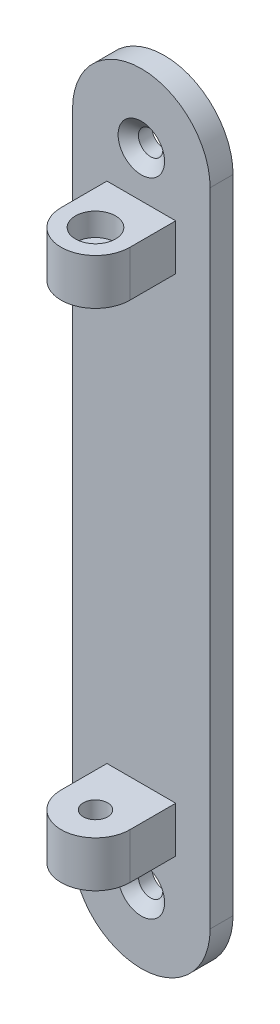
ISO-10303-21;
HEADER;
FILE_DESCRIPTION(('STEP AP214'),'2;1');
FILE_NAME('part.step','',(''),(''),'','','');
FILE_SCHEMA(('AUTOMOTIVE_DESIGN { 1 0 10303 214 1 1 1 1 }'));
ENDSEC;
DATA;
#1=APPLICATION_CONTEXT('core data for automotive mechanical design processes');
#2=APPLICATION_PROTOCOL_DEFINITION('international standard','automotive_design',2000,#1);
#3=PRODUCT_CONTEXT('',#1,'mechanical');
#4=PRODUCT('Part','Part','',(#3));
#5=PRODUCT_RELATED_PRODUCT_CATEGORY('part','',(#4));
#6=PRODUCT_DEFINITION_FORMATION('','',#4);
#7=PRODUCT_DEFINITION_CONTEXT('part definition',#1,'design');
#8=PRODUCT_DEFINITION('design','',#6,#7);
#9=PRODUCT_DEFINITION_SHAPE('','',#8);
#10=(LENGTH_UNIT() NAMED_UNIT(*) SI_UNIT(.MILLI.,.METRE.));
#11=(NAMED_UNIT(*) PLANE_ANGLE_UNIT() SI_UNIT($,.RADIAN.));
#12=(NAMED_UNIT(*) SI_UNIT($,.STERADIAN.) SOLID_ANGLE_UNIT());
#13=UNCERTAINTY_MEASURE_WITH_UNIT(LENGTH_MEASURE(1.E-05),#10,'distance_accuracy_value','');
#14=(GEOMETRIC_REPRESENTATION_CONTEXT(3) GLOBAL_UNCERTAINTY_ASSIGNED_CONTEXT((#13)) GLOBAL_UNIT_ASSIGNED_CONTEXT((#10,
#11,#12)) REPRESENTATION_CONTEXT('',''));
#15=CARTESIAN_POINT('',(0.,0.,0.));
#16=DIRECTION('',(0.,0.,1.));
#17=DIRECTION('',(1.,0.,0.));
#18=AXIS2_PLACEMENT_3D('',#15,#16,#17);
#19=CARTESIAN_POINT('',(19.05,88.9,6.35));
#20=DIRECTION('',(0.,0.,1.));
#21=DIRECTION('',(1.,0.,0.));
#22=AXIS2_PLACEMENT_3D('',#19,#20,#21);
#23=PLANE('',#22);
#24=CARTESIAN_POINT('',(19.05,88.9,6.35));
#25=DIRECTION('',(0.,0.,1.));
#26=DIRECTION('',(1.,0.,0.));
#27=AXIS2_PLACEMENT_3D('',#24,#25,#26);
#28=CIRCLE('',#27,6.4389);
#29=CARTESIAN_POINT('',(25.4889,88.9,6.35));
#30=VERTEX_POINT('',#29);
#31=EDGE_CURVE('E125',#30,#30,#28,.T.);
#32=ORIENTED_EDGE('',*,*,#31,.F.);
#33=EDGE_LOOP('',(#32));
#34=FACE_BOUND('',#33,.T.);
#35=DIRECTION('',(0.,-1.,0.));
#36=VECTOR('',#35,1.);
#37=CARTESIAN_POINT('',(0.,88.9,6.35));
#38=LINE('',#37,#36);
#39=CARTESIAN_POINT('',(0.,88.9,6.35));
#40=VERTEX_POINT('',#39);
#41=CARTESIAN_POINT('',(0.,-88.9,6.35));
#42=VERTEX_POINT('',#41);
#43=EDGE_CURVE('E90',#40,#42,#38,.T.);
#44=ORIENTED_EDGE('',*,*,#43,.T.);
#45=CARTESIAN_POINT('',(19.05,-88.9,6.35));
#46=DIRECTION('',(0.,0.,-1.));
#47=DIRECTION('',(1.,0.,0.));
#48=AXIS2_PLACEMENT_3D('',#45,#46,#47);
#49=CIRCLE('',#48,19.05);
#50=CARTESIAN_POINT('',(38.1,-88.9,6.35));
#51=VERTEX_POINT('',#50);
#52=EDGE_CURVE('E195',#51,#42,#49,.T.);
#53=ORIENTED_EDGE('',*,*,#52,.F.);
#54=DIRECTION('',(0.,1.,0.));
#55=VECTOR('',#54,1.);
#56=CARTESIAN_POINT('',(38.1,0.,6.35));
#57=LINE('',#56,#55);
#58=CARTESIAN_POINT('',(38.1,88.9,6.35));
#59=VERTEX_POINT('',#58);
#60=EDGE_CURVE('E117',#51,#59,#57,.T.);
#61=ORIENTED_EDGE('',*,*,#60,.T.);
#62=CARTESIAN_POINT('',(19.05,88.9,6.35));
#63=DIRECTION('',(0.,0.,1.));
#64=DIRECTION('',(1.,0.,0.));
#65=AXIS2_PLACEMENT_3D('',#62,#63,#64);
#66=CIRCLE('',#65,19.05);
#67=EDGE_CURVE('E69',#59,#40,#66,.T.);
#68=ORIENTED_EDGE('',*,*,#67,.T.);
#69=EDGE_LOOP('',(#44,#53,#61,#68));
#70=FACE_BOUND('',#69,.T.);
#71=DIRECTION('',(-1.,0.,0.));
#72=VECTOR('',#71,1.);
#73=CARTESIAN_POINT('',(9.52500000000001,76.2,6.35));
#74=LINE('',#73,#72);
#75=CARTESIAN_POINT('',(28.575,76.2,6.35));
#76=VERTEX_POINT('',#75);
#77=CARTESIAN_POINT('',(9.52500000000001,76.2,6.35));
#78=VERTEX_POINT('',#77);
#79=EDGE_CURVE('E151',#76,#78,#74,.T.);
#80=ORIENTED_EDGE('',*,*,#79,.F.);
#81=DIRECTION('',(0.,1.,0.));
#82=VECTOR('',#81,1.);
#83=CARTESIAN_POINT('',(28.575,76.2,6.35));
#84=LINE('',#83,#82);
#85=CARTESIAN_POINT('',(28.575,63.5,6.35));
#86=VERTEX_POINT('',#85);
#87=EDGE_CURVE('E155',#86,#76,#84,.T.);
#88=ORIENTED_EDGE('',*,*,#87,.F.);
#89=DIRECTION('',(1.,0.,0.));
#90=VECTOR('',#89,1.);
#91=CARTESIAN_POINT('',(9.52500000000001,63.5,6.35));
#92=LINE('',#91,#90);
#93=CARTESIAN_POINT('',(9.52500000000001,63.5,6.35));
#94=VERTEX_POINT('',#93);
#95=EDGE_CURVE('E144',#94,#86,#92,.T.);
#96=ORIENTED_EDGE('',*,*,#95,.F.);
#97=DIRECTION('',(0.,-1.,0.));
#98=VECTOR('',#97,1.);
#99=CARTESIAN_POINT('',(9.52500000000001,76.2,6.35));
#100=LINE('',#99,#98);
#101=EDGE_CURVE('E148',#78,#94,#100,.T.);
#102=ORIENTED_EDGE('',*,*,#101,.F.);
#103=EDGE_LOOP('',(#80,#88,#96,#102));
#104=FACE_BOUND('',#103,.T.);
#105=CARTESIAN_POINT('',(19.05,-88.9,6.35));
#106=DIRECTION('',(0.,0.,-1.));
#107=DIRECTION('',(1.,0.,0.));
#108=AXIS2_PLACEMENT_3D('',#105,#106,#107);
#109=CIRCLE('',#108,6.4389);
#110=CARTESIAN_POINT('',(25.4889,-88.9,6.35));
#111=VERTEX_POINT('',#110);
#112=EDGE_CURVE('E209',#111,#111,#109,.T.);
#113=ORIENTED_EDGE('',*,*,#112,.T.);
#114=EDGE_LOOP('',(#113));
#115=FACE_BOUND('',#114,.T.);
#116=DIRECTION('',(-1.,0.,0.));
#117=VECTOR('',#116,1.);
#118=CARTESIAN_POINT('',(9.52500000000001,-76.2,6.35));
#119=LINE('',#118,#117);
#120=CARTESIAN_POINT('',(28.575,-76.2,6.35));
#121=VERTEX_POINT('',#120);
#122=CARTESIAN_POINT('',(9.52500000000001,-76.2,6.35));
#123=VERTEX_POINT('',#122);
#124=EDGE_CURVE('E239',#121,#123,#119,.T.);
#125=ORIENTED_EDGE('',*,*,#124,.T.);
#126=DIRECTION('',(0.,1.,0.));
#127=VECTOR('',#126,1.);
#128=CARTESIAN_POINT('',(9.52500000000001,-76.2,6.35));
#129=LINE('',#128,#127);
#130=CARTESIAN_POINT('',(9.52500000000001,-63.5,6.35));
#131=VERTEX_POINT('',#130);
#132=EDGE_CURVE('E235',#123,#131,#129,.T.);
#133=ORIENTED_EDGE('',*,*,#132,.T.);
#134=DIRECTION('',(1.,0.,0.));
#135=VECTOR('',#134,1.);
#136=CARTESIAN_POINT('',(9.52500000000001,-63.5,6.35));
#137=LINE('',#136,#135);
#138=CARTESIAN_POINT('',(28.575,-63.5,6.35));
#139=VERTEX_POINT('',#138);
#140=EDGE_CURVE('E230',#131,#139,#137,.T.);
#141=ORIENTED_EDGE('',*,*,#140,.T.);
#142=DIRECTION('',(0.,-1.,0.));
#143=VECTOR('',#142,1.);
#144=CARTESIAN_POINT('',(28.575,-76.2,6.35));
#145=LINE('',#144,#143);
#146=EDGE_CURVE('E243',#139,#121,#145,.T.);
#147=ORIENTED_EDGE('',*,*,#146,.T.);
#148=EDGE_LOOP('',(#125,#133,#141,#147));
#149=FACE_BOUND('',#148,.T.);
#150=ADVANCED_FACE('F44',(#34,#70,#104,#115,#149),#23,.T.);
#151=CARTESIAN_POINT('',(0.,88.9,6.35));
#152=DIRECTION('',(1.,0.,0.));
#153=DIRECTION('',(0.,0.,-1.));
#154=AXIS2_PLACEMENT_3D('',#151,#152,#153);
#155=PLANE('',#154);
#156=DIRECTION('',(0.,-1.,0.));
#157=VECTOR('',#156,1.);
#158=CARTESIAN_POINT('',(0.,88.9,0.));
#159=LINE('',#158,#157);
#160=CARTESIAN_POINT('',(0.,88.9,0.));
#161=VERTEX_POINT('',#160);
#162=CARTESIAN_POINT('',(0.,-88.9,0.));
#163=VERTEX_POINT('',#162);
#164=EDGE_CURVE('E97',#161,#163,#159,.T.);
#165=ORIENTED_EDGE('',*,*,#164,.T.);
#166=DIRECTION('',(0.,0.,-1.));
#167=VECTOR('',#166,1.);
#168=CARTESIAN_POINT('',(0.,-88.9,6.35));
#169=LINE('',#168,#167);
#170=EDGE_CURVE('E192',#42,#163,#169,.T.);
#171=ORIENTED_EDGE('',*,*,#170,.F.);
#172=ORIENTED_EDGE('',*,*,#43,.F.);
#173=DIRECTION('',(0.,0.,-1.));
#174=VECTOR('',#173,1.);
#175=CARTESIAN_POINT('',(0.,88.9,6.35));
#176=LINE('',#175,#174);
#177=EDGE_CURVE('E53',#40,#161,#176,.T.);
#178=ORIENTED_EDGE('',*,*,#177,.T.);
#179=EDGE_LOOP('',(#165,#171,#172,#178));
#180=FACE_BOUND('',#179,.T.);
#181=ADVANCED_FACE('F46',(#180),#155,.F.);
#182=CARTESIAN_POINT('',(38.1,0.,6.35));
#183=DIRECTION('',(-1.,0.,0.));
#184=DIRECTION('',(0.,0.,1.));
#185=AXIS2_PLACEMENT_3D('',#182,#183,#184);
#186=PLANE('',#185);
#187=DIRECTION('',(0.,1.,0.));
#188=VECTOR('',#187,1.);
#189=CARTESIAN_POINT('',(38.1,0.,0.));
#190=LINE('',#189,#188);
#191=CARTESIAN_POINT('',(38.1,-88.9,0.));
#192=VERTEX_POINT('',#191);
#193=CARTESIAN_POINT('',(38.1,88.9,0.));
#194=VERTEX_POINT('',#193);
#195=EDGE_CURVE('E91',#192,#194,#190,.T.);
#196=ORIENTED_EDGE('',*,*,#195,.T.);
#197=DIRECTION('',(0.,0.,-1.));
#198=VECTOR('',#197,1.);
#199=CARTESIAN_POINT('',(38.1,88.9,6.35));
#200=LINE('',#199,#198);
#201=EDGE_CURVE('E11',#59,#194,#200,.T.);
#202=ORIENTED_EDGE('',*,*,#201,.F.);
#203=ORIENTED_EDGE('',*,*,#60,.F.);
#204=DIRECTION('',(0.,0.,-1.));
#205=VECTOR('',#204,1.);
#206=CARTESIAN_POINT('',(38.1,-88.9,6.35));
#207=LINE('',#206,#205);
#208=EDGE_CURVE('E185',#51,#192,#207,.T.);
#209=ORIENTED_EDGE('',*,*,#208,.T.);
#210=EDGE_LOOP('',(#196,#202,#203,#209));
#211=FACE_BOUND('',#210,.T.);
#212=ADVANCED_FACE('F386',(#211),#186,.F.);
#213=CARTESIAN_POINT('',(19.05,88.9,6.35));
#214=DIRECTION('',(0.,0.,-1.));
#215=DIRECTION('',(-1.,0.,0.));
#216=AXIS2_PLACEMENT_3D('',#213,#214,#215);
#217=CYLINDRICAL_SURFACE('',#216,19.05);
#218=CARTESIAN_POINT('',(19.05,88.9,0.));
#219=DIRECTION('',(0.,0.,1.));
#220=DIRECTION('',(1.,0.,0.));
#221=AXIS2_PLACEMENT_3D('',#218,#219,#220);
#222=CIRCLE('',#221,19.05);
#223=EDGE_CURVE('E81',#194,#161,#222,.T.);
#224=ORIENTED_EDGE('',*,*,#223,.T.);
#225=ORIENTED_EDGE('',*,*,#177,.F.);
#226=ORIENTED_EDGE('',*,*,#67,.F.);
#227=ORIENTED_EDGE('',*,*,#201,.T.);
#228=EDGE_LOOP('',(#224,#225,#226,#227));
#229=FACE_BOUND('',#228,.T.);
#230=ADVANCED_FACE('F83',(#229),#217,.T.);
#231=CARTESIAN_POINT('',(19.05,88.9,0.));
#232=DIRECTION('',(0.,0.,1.));
#233=DIRECTION('',(1.,0.,0.));
#234=AXIS2_PLACEMENT_3D('',#231,#232,#233);
#235=PLANE('',#234);
#236=CARTESIAN_POINT('',(19.05,88.9,0.));
#237=DIRECTION('',(0.,0.,1.));
#238=DIRECTION('',(1.,0.,0.));
#239=AXIS2_PLACEMENT_3D('',#236,#237,#238);
#240=CIRCLE('',#239,3.3782);
#241=CARTESIAN_POINT('',(22.4282,88.9,0.));
#242=VERTEX_POINT('',#241);
#243=EDGE_CURVE('E106',#242,#242,#240,.T.);
#244=ORIENTED_EDGE('',*,*,#243,.T.);
#245=EDGE_LOOP('',(#244));
#246=FACE_BOUND('',#245,.T.);
#247=ORIENTED_EDGE('',*,*,#164,.F.);
#248=ORIENTED_EDGE('',*,*,#223,.F.);
#249=ORIENTED_EDGE('',*,*,#195,.F.);
#250=CARTESIAN_POINT('',(19.05,-88.9,0.));
#251=DIRECTION('',(0.,0.,-1.));
#252=DIRECTION('',(1.,0.,0.));
#253=AXIS2_PLACEMENT_3D('',#250,#251,#252);
#254=CIRCLE('',#253,19.05);
#255=EDGE_CURVE('E103',#192,#163,#254,.T.);
#256=ORIENTED_EDGE('',*,*,#255,.T.);
#257=EDGE_LOOP('',(#247,#248,#249,#256));
#258=FACE_BOUND('',#257,.T.);
#259=CARTESIAN_POINT('',(19.05,-88.9,0.));
#260=DIRECTION('',(0.,0.,-1.));
#261=DIRECTION('',(1.,0.,0.));
#262=AXIS2_PLACEMENT_3D('',#259,#260,#261);
#263=CIRCLE('',#262,3.3782);
#264=CARTESIAN_POINT('',(22.4282,-88.9,0.));
#265=VERTEX_POINT('',#264);
#266=EDGE_CURVE('E198',#265,#265,#263,.T.);
#267=ORIENTED_EDGE('',*,*,#266,.F.);
#268=EDGE_LOOP('',(#267));
#269=FACE_BOUND('',#268,.T.);
#270=ADVANCED_FACE('F100',(#246,#258,#269),#235,.F.);
#271=CARTESIAN_POINT('',(19.05,88.9,6.35));
#272=DIRECTION('',(0.,0.,1.));
#273=DIRECTION('',(1.,0.,0.));
#274=AXIS2_PLACEMENT_3D('',#271,#272,#273);
#275=CYLINDRICAL_SURFACE('',#274,3.3782);
#276=ORIENTED_EDGE('',*,*,#243,.F.);
#277=EDGE_LOOP('',(#276));
#278=FACE_BOUND('',#277,.T.);
#279=CARTESIAN_POINT('',(19.05,88.9,3.78176775885569));
#280=DIRECTION('',(0.,0.,1.));
#281=DIRECTION('',(1.,0.,0.));
#282=AXIS2_PLACEMENT_3D('',#279,#280,#281);
#283=CIRCLE('',#282,3.3782);
#284=CARTESIAN_POINT('',(22.4282,88.9,3.78176775885569));
#285=VERTEX_POINT('',#284);
#286=EDGE_CURVE('E112',#285,#285,#283,.T.);
#287=ORIENTED_EDGE('',*,*,#286,.T.);
#288=EDGE_LOOP('',(#287));
#289=FACE_BOUND('',#288,.T.);
#290=ADVANCED_FACE('F390',(#278,#289),#275,.F.);
#291=CARTESIAN_POINT('',(19.05,88.9,6.35));
#292=DIRECTION('',(0.,0.,1.));
#293=DIRECTION('',(1.,0.,0.));
#294=AXIS2_PLACEMENT_3D('',#291,#292,#293);
#295=CONICAL_SURFACE('',#294,6.4389,0.872664625997164);
#296=ORIENTED_EDGE('',*,*,#286,.F.);
#297=EDGE_LOOP('',(#296));
#298=FACE_BOUND('',#297,.T.);
#299=ORIENTED_EDGE('',*,*,#31,.T.);
#300=EDGE_LOOP('',(#299));
#301=FACE_BOUND('',#300,.T.);
#302=ADVANCED_FACE('F436',(#298,#301),#295,.F.);
#303=CARTESIAN_POINT('',(28.575,76.2,19.05));
#304=DIRECTION('',(-1.,0.,0.));
#305=DIRECTION('',(0.,0.,1.));
#306=AXIS2_PLACEMENT_3D('',#303,#304,#305);
#307=PLANE('',#306);
#308=ORIENTED_EDGE('',*,*,#87,.T.);
#309=DIRECTION('',(0.,0.,-1.));
#310=VECTOR('',#309,1.);
#311=CARTESIAN_POINT('',(28.575,76.2,19.05));
#312=LINE('',#311,#310);
#313=CARTESIAN_POINT('',(28.575,76.2,19.05));
#314=VERTEX_POINT('',#313);
#315=EDGE_CURVE('E129',#314,#76,#312,.T.);
#316=ORIENTED_EDGE('',*,*,#315,.F.);
#317=DIRECTION('',(0.,1.,0.));
#318=VECTOR('',#317,1.);
#319=CARTESIAN_POINT('',(28.575,76.2,19.05));
#320=LINE('',#319,#318);
#321=CARTESIAN_POINT('',(28.575,63.5,19.05));
#322=VERTEX_POINT('',#321);
#323=EDGE_CURVE('E147',#322,#314,#320,.T.);
#324=ORIENTED_EDGE('',*,*,#323,.F.);
#325=DIRECTION('',(0.,0.,-1.));
#326=VECTOR('',#325,1.);
#327=CARTESIAN_POINT('',(28.575,63.5,19.05));
#328=LINE('',#327,#326);
#329=EDGE_CURVE('E139',#322,#86,#328,.T.);
#330=ORIENTED_EDGE('',*,*,#329,.T.);
#331=EDGE_LOOP('',(#308,#316,#324,#330));
#332=FACE_BOUND('',#331,.T.);
#333=ADVANCED_FACE('F356',(#332),#307,.F.);
#334=CARTESIAN_POINT('',(9.52500000000001,76.2,19.05));
#335=DIRECTION('',(0.,-1.,0.));
#336=DIRECTION('',(0.,0.,-1.));
#337=AXIS2_PLACEMENT_3D('',#334,#335,#336);
#338=PLANE('',#337);
#339=CARTESIAN_POINT('',(19.05,76.2,19.05));
#340=DIRECTION('',(0.,1.,0.));
#341=DIRECTION('',(0.,0.,1.));
#342=AXIS2_PLACEMENT_3D('',#339,#340,#341);
#343=CIRCLE('',#342,5.55625);
#344=CARTESIAN_POINT('',(19.05,76.2,24.60625));
#345=VERTEX_POINT('',#344);
#346=EDGE_CURVE('E181',#345,#345,#343,.T.);
#347=ORIENTED_EDGE('',*,*,#346,.F.);
#348=EDGE_LOOP('',(#347));
#349=FACE_BOUND('',#348,.T.);
#350=ORIENTED_EDGE('',*,*,#79,.T.);
#351=DIRECTION('',(0.,0.,-1.));
#352=VECTOR('',#351,1.);
#353=CARTESIAN_POINT('',(9.52500000000001,76.2,19.05));
#354=LINE('',#353,#352);
#355=CARTESIAN_POINT('',(9.52500000000001,76.2,19.05));
#356=VERTEX_POINT('',#355);
#357=EDGE_CURVE('E133',#356,#78,#354,.T.);
#358=ORIENTED_EDGE('',*,*,#357,.F.);
#359=CARTESIAN_POINT('',(19.05,76.2,19.05));
#360=DIRECTION('',(0.,1.,0.));
#361=DIRECTION('',(0.,0.,-1.));
#362=AXIS2_PLACEMENT_3D('',#359,#360,#361);
#363=CIRCLE('',#362,9.525);
#364=EDGE_CURVE('E166',#356,#314,#363,.T.);
#365=ORIENTED_EDGE('',*,*,#364,.T.);
#366=ORIENTED_EDGE('',*,*,#315,.T.);
#367=EDGE_LOOP('',(#350,#358,#365,#366));
#368=FACE_BOUND('',#367,.T.);
#369=ADVANCED_FACE('F360',(#349,#368),#338,.F.);
#370=CARTESIAN_POINT('',(9.52500000000001,76.2,19.05));
#371=DIRECTION('',(1.,0.,0.));
#372=DIRECTION('',(0.,0.,-1.));
#373=AXIS2_PLACEMENT_3D('',#370,#371,#372);
#374=PLANE('',#373);
#375=ORIENTED_EDGE('',*,*,#101,.T.);
#376=DIRECTION('',(0.,0.,-1.));
#377=VECTOR('',#376,1.);
#378=CARTESIAN_POINT('',(9.52500000000001,63.5,19.05));
#379=LINE('',#378,#377);
#380=CARTESIAN_POINT('',(9.52500000000001,63.5,19.05));
#381=VERTEX_POINT('',#380);
#382=EDGE_CURVE('E60',#381,#94,#379,.T.);
#383=ORIENTED_EDGE('',*,*,#382,.F.);
#384=DIRECTION('',(0.,-1.,0.));
#385=VECTOR('',#384,1.);
#386=CARTESIAN_POINT('',(9.52500000000001,76.2,19.05));
#387=LINE('',#386,#385);
#388=EDGE_CURVE('E143',#356,#381,#387,.T.);
#389=ORIENTED_EDGE('',*,*,#388,.F.);
#390=ORIENTED_EDGE('',*,*,#357,.T.);
#391=EDGE_LOOP('',(#375,#383,#389,#390));
#392=FACE_BOUND('',#391,.T.);
#393=ADVANCED_FACE('F363',(#392),#374,.F.);
#394=CARTESIAN_POINT('',(9.52500000000001,63.5,19.05));
#395=DIRECTION('',(0.,1.,0.));
#396=DIRECTION('',(0.,0.,1.));
#397=AXIS2_PLACEMENT_3D('',#394,#395,#396);
#398=PLANE('',#397);
#399=CARTESIAN_POINT('',(19.05,63.5,19.05));
#400=DIRECTION('',(0.,1.,0.));
#401=DIRECTION('',(0.,0.,1.));
#402=AXIS2_PLACEMENT_3D('',#399,#400,#401);
#403=CIRCLE('',#402,3.3782);
#404=CARTESIAN_POINT('',(19.05,63.5,22.4282));
#405=VERTEX_POINT('',#404);
#406=EDGE_CURVE('E170',#405,#405,#403,.F.);
#407=ORIENTED_EDGE('',*,*,#406,.F.);
#408=EDGE_LOOP('',(#407));
#409=FACE_BOUND('',#408,.T.);
#410=ORIENTED_EDGE('',*,*,#95,.T.);
#411=ORIENTED_EDGE('',*,*,#329,.F.);
#412=CARTESIAN_POINT('',(19.05,63.5,19.05));
#413=DIRECTION('',(0.,1.,0.));
#414=DIRECTION('',(0.,0.,1.));
#415=AXIS2_PLACEMENT_3D('',#412,#413,#414);
#416=CIRCLE('',#415,9.525);
#417=EDGE_CURVE('E159',#322,#381,#416,.F.);
#418=ORIENTED_EDGE('',*,*,#417,.T.);
#419=ORIENTED_EDGE('',*,*,#382,.T.);
#420=EDGE_LOOP('',(#410,#411,#418,#419));
#421=FACE_BOUND('',#420,.T.);
#422=ADVANCED_FACE('F350',(#409,#421),#398,.F.);
#423=CARTESIAN_POINT('',(19.05,42.2014525143145,19.05));
#424=DIRECTION('',(0.,1.,0.));
#425=DIRECTION('',(0.,0.,1.));
#426=AXIS2_PLACEMENT_3D('',#423,#424,#425);
#427=CYLINDRICAL_SURFACE('',#426,9.525);
#428=ORIENTED_EDGE('',*,*,#417,.F.);
#429=ORIENTED_EDGE('',*,*,#323,.T.);
#430=ORIENTED_EDGE('',*,*,#364,.F.);
#431=ORIENTED_EDGE('',*,*,#388,.T.);
#432=EDGE_LOOP('',(#428,#429,#430,#431));
#433=FACE_BOUND('',#432,.T.);
#434=ADVANCED_FACE('F366',(#433),#427,.T.);
#435=CARTESIAN_POINT('',(19.05,76.2,19.05));
#436=DIRECTION('',(0.,1.,0.));
#437=DIRECTION('',(0.,0.,1.));
#438=AXIS2_PLACEMENT_3D('',#435,#436,#437);
#439=CYLINDRICAL_SURFACE('',#438,3.3782);
#440=ORIENTED_EDGE('',*,*,#406,.T.);
#441=EDGE_LOOP('',(#440));
#442=FACE_BOUND('',#441,.T.);
#443=CARTESIAN_POINT('',(19.05,69.85,19.05));
#444=DIRECTION('',(0.,1.,0.));
#445=DIRECTION('',(0.,0.,1.));
#446=AXIS2_PLACEMENT_3D('',#443,#444,#445);
#447=CIRCLE('',#446,3.3782);
#448=CARTESIAN_POINT('',(19.05,69.85,22.4282));
#449=VERTEX_POINT('',#448);
#450=EDGE_CURVE('E173',#449,#449,#447,.T.);
#451=ORIENTED_EDGE('',*,*,#450,.T.);
#452=EDGE_LOOP('',(#451));
#453=FACE_BOUND('',#452,.T.);
#454=ADVANCED_FACE('F368',(#442,#453),#439,.F.);
#455=CARTESIAN_POINT('',(22.4282,69.85,19.05));
#456=DIRECTION('',(0.,-1.,0.));
#457=DIRECTION('',(0.,0.,-1.));
#458=AXIS2_PLACEMENT_3D('',#455,#456,#457);
#459=PLANE('',#458);
#460=ORIENTED_EDGE('',*,*,#450,.F.);
#461=EDGE_LOOP('',(#460));
#462=FACE_BOUND('',#461,.T.);
#463=CARTESIAN_POINT('',(19.05,69.85,19.05));
#464=DIRECTION('',(0.,1.,0.));
#465=DIRECTION('',(0.,0.,1.));
#466=AXIS2_PLACEMENT_3D('',#463,#464,#465);
#467=CIRCLE('',#466,5.55625);
#468=CARTESIAN_POINT('',(19.05,69.85,24.60625));
#469=VERTEX_POINT('',#468);
#470=EDGE_CURVE('E177',#469,#469,#467,.T.);
#471=ORIENTED_EDGE('',*,*,#470,.T.);
#472=EDGE_LOOP('',(#471));
#473=FACE_BOUND('',#472,.T.);
#474=ADVANCED_FACE('F374',(#462,#473),#459,.F.);
#475=CARTESIAN_POINT('',(19.05,76.2,19.05));
#476=DIRECTION('',(0.,1.,0.));
#477=DIRECTION('',(0.,0.,1.));
#478=AXIS2_PLACEMENT_3D('',#475,#476,#477);
#479=CYLINDRICAL_SURFACE('',#478,5.55625);
#480=ORIENTED_EDGE('',*,*,#470,.F.);
#481=EDGE_LOOP('',(#480));
#482=FACE_BOUND('',#481,.T.);
#483=ORIENTED_EDGE('',*,*,#346,.T.);
#484=EDGE_LOOP('',(#483));
#485=FACE_BOUND('',#484,.T.);
#486=ADVANCED_FACE('F406',(#482,#485),#479,.F.);
#487=CARTESIAN_POINT('',(19.05,-88.9,6.35));
#488=DIRECTION('',(0.,0.,-1.));
#489=DIRECTION('',(-1.,0.,0.));
#490=AXIS2_PLACEMENT_3D('',#487,#488,#489);
#491=CYLINDRICAL_SURFACE('',#490,19.05);
#492=ORIENTED_EDGE('',*,*,#255,.F.);
#493=ORIENTED_EDGE('',*,*,#208,.F.);
#494=ORIENTED_EDGE('',*,*,#52,.T.);
#495=ORIENTED_EDGE('',*,*,#170,.T.);
#496=EDGE_LOOP('',(#492,#493,#494,#495));
#497=FACE_BOUND('',#496,.T.);
#498=ADVANCED_FACE('F402',(#497),#491,.T.);
#499=CARTESIAN_POINT('',(19.05,-88.9,6.35));
#500=DIRECTION('',(0.,0.,1.));
#501=DIRECTION('',(1.,0.,0.));
#502=AXIS2_PLACEMENT_3D('',#499,#500,#501);
#503=CYLINDRICAL_SURFACE('',#502,3.3782);
#504=ORIENTED_EDGE('',*,*,#266,.T.);
#505=EDGE_LOOP('',(#504));
#506=FACE_BOUND('',#505,.T.);
#507=CARTESIAN_POINT('',(19.05,-88.9,3.78176775885569));
#508=DIRECTION('',(0.,0.,-1.));
#509=DIRECTION('',(1.,0.,0.));
#510=AXIS2_PLACEMENT_3D('',#507,#508,#509);
#511=CIRCLE('',#510,3.3782);
#512=CARTESIAN_POINT('',(22.4282,-88.9,3.78176775885569));
#513=VERTEX_POINT('',#512);
#514=EDGE_CURVE('E205',#513,#513,#511,.T.);
#515=ORIENTED_EDGE('',*,*,#514,.F.);
#516=EDGE_LOOP('',(#515));
#517=FACE_BOUND('',#516,.T.);
#518=ADVANCED_FACE('F405',(#506,#517),#503,.F.);
#519=CARTESIAN_POINT('',(19.05,-88.9,6.35));
#520=DIRECTION('',(0.,0.,1.));
#521=DIRECTION('',(1.,0.,0.));
#522=AXIS2_PLACEMENT_3D('',#519,#520,#521);
#523=CONICAL_SURFACE('',#522,6.4389,0.872664625997164);
#524=ORIENTED_EDGE('',*,*,#514,.T.);
#525=EDGE_LOOP('',(#524));
#526=FACE_BOUND('',#525,.T.);
#527=ORIENTED_EDGE('',*,*,#112,.F.);
#528=EDGE_LOOP('',(#527));
#529=FACE_BOUND('',#528,.T.);
#530=ADVANCED_FACE('F411',(#526,#529),#523,.F.);
#531=CARTESIAN_POINT('',(28.575,-76.2,19.05));
#532=DIRECTION('',(-1.,0.,0.));
#533=DIRECTION('',(0.,0.,1.));
#534=AXIS2_PLACEMENT_3D('',#531,#532,#533);
#535=PLANE('',#534);
#536=ORIENTED_EDGE('',*,*,#146,.F.);
#537=DIRECTION('',(0.,0.,-1.));
#538=VECTOR('',#537,1.);
#539=CARTESIAN_POINT('',(28.575,-63.5,19.05));
#540=LINE('',#539,#538);
#541=CARTESIAN_POINT('',(28.575,-63.5,19.05));
#542=VERTEX_POINT('',#541);
#543=EDGE_CURVE('E225',#542,#139,#540,.T.);
#544=ORIENTED_EDGE('',*,*,#543,.F.);
#545=DIRECTION('',(0.,-1.,0.));
#546=VECTOR('',#545,1.);
#547=CARTESIAN_POINT('',(28.575,-76.2,19.05));
#548=LINE('',#547,#546);
#549=CARTESIAN_POINT('',(28.575,-76.2,19.05));
#550=VERTEX_POINT('',#549);
#551=EDGE_CURVE('E234',#542,#550,#548,.T.);
#552=ORIENTED_EDGE('',*,*,#551,.T.);
#553=DIRECTION('',(0.,0.,-1.));
#554=VECTOR('',#553,1.);
#555=CARTESIAN_POINT('',(28.575,-76.2,19.05));
#556=LINE('',#555,#554);
#557=EDGE_CURVE('E213',#550,#121,#556,.T.);
#558=ORIENTED_EDGE('',*,*,#557,.T.);
#559=EDGE_LOOP('',(#536,#544,#552,#558));
#560=FACE_BOUND('',#559,.T.);
#561=ADVANCED_FACE('F304',(#560),#535,.F.);
#562=CARTESIAN_POINT('',(9.52500000000001,-76.2,19.05));
#563=DIRECTION('',(0.,1.,0.));
#564=DIRECTION('',(0.,0.,-1.));
#565=AXIS2_PLACEMENT_3D('',#562,#563,#564);
#566=PLANE('',#565);
#567=CARTESIAN_POINT('',(19.05,-76.2,19.05));
#568=DIRECTION('',(0.,1.,0.));
#569=DIRECTION('',(0.,0.,1.));
#570=AXIS2_PLACEMENT_3D('',#567,#568,#569);
#571=CIRCLE('',#570,5.55625);
#572=CARTESIAN_POINT('',(19.05,-76.2,24.60625));
#573=VERTEX_POINT('',#572);
#574=EDGE_CURVE('E270',#573,#573,#571,.T.);
#575=ORIENTED_EDGE('',*,*,#574,.T.);
#576=EDGE_LOOP('',(#575));
#577=FACE_BOUND('',#576,.T.);
#578=ORIENTED_EDGE('',*,*,#124,.F.);
#579=ORIENTED_EDGE('',*,*,#557,.F.);
#580=CARTESIAN_POINT('',(19.05,-76.2,19.05));
#581=DIRECTION('',(0.,1.,0.));
#582=DIRECTION('',(0.,0.,-1.));
#583=AXIS2_PLACEMENT_3D('',#580,#581,#582);
#584=CIRCLE('',#583,9.525);
#585=CARTESIAN_POINT('',(9.52500000000001,-76.2,19.05));
#586=VERTEX_POINT('',#585);
#587=EDGE_CURVE('E254',#586,#550,#584,.T.);
#588=ORIENTED_EDGE('',*,*,#587,.F.);
#589=DIRECTION('',(0.,0.,-1.));
#590=VECTOR('',#589,1.);
#591=CARTESIAN_POINT('',(9.52500000000001,-76.2,19.05));
#592=LINE('',#591,#590);
#593=EDGE_CURVE('E217',#586,#123,#592,.T.);
#594=ORIENTED_EDGE('',*,*,#593,.T.);
#595=EDGE_LOOP('',(#578,#579,#588,#594));
#596=FACE_BOUND('',#595,.T.);
#597=ADVANCED_FACE('F300',(#577,#596),#566,.F.);
#598=CARTESIAN_POINT('',(9.52500000000001,-76.2,19.05));
#599=DIRECTION('',(1.,0.,0.));
#600=DIRECTION('',(0.,0.,-1.));
#601=AXIS2_PLACEMENT_3D('',#598,#599,#600);
#602=PLANE('',#601);
#603=ORIENTED_EDGE('',*,*,#132,.F.);
#604=ORIENTED_EDGE('',*,*,#593,.F.);
#605=DIRECTION('',(0.,1.,0.));
#606=VECTOR('',#605,1.);
#607=CARTESIAN_POINT('',(9.52500000000001,-76.2,19.05));
#608=LINE('',#607,#606);
#609=CARTESIAN_POINT('',(9.52500000000001,-63.5,19.05));
#610=VERTEX_POINT('',#609);
#611=EDGE_CURVE('E229',#586,#610,#608,.T.);
#612=ORIENTED_EDGE('',*,*,#611,.T.);
#613=DIRECTION('',(0.,0.,-1.));
#614=VECTOR('',#613,1.);
#615=CARTESIAN_POINT('',(9.52500000000001,-63.5,19.05));
#616=LINE('',#615,#614);
#617=EDGE_CURVE('E221',#610,#131,#616,.T.);
#618=ORIENTED_EDGE('',*,*,#617,.T.);
#619=EDGE_LOOP('',(#603,#604,#612,#618));
#620=FACE_BOUND('',#619,.T.);
#621=ADVANCED_FACE('F303',(#620),#602,.F.);
#622=CARTESIAN_POINT('',(9.52500000000001,-63.5,19.05));
#623=DIRECTION('',(0.,-1.,0.));
#624=DIRECTION('',(0.,0.,1.));
#625=AXIS2_PLACEMENT_3D('',#622,#623,#624);
#626=PLANE('',#625);
#627=CARTESIAN_POINT('',(19.05,-63.5,19.05));
#628=DIRECTION('',(0.,1.,0.));
#629=DIRECTION('',(0.,0.,1.));
#630=AXIS2_PLACEMENT_3D('',#627,#628,#629);
#631=CIRCLE('',#630,3.3782);
#632=CARTESIAN_POINT('',(19.05,-63.5,22.4282));
#633=VERTEX_POINT('',#632);
#634=EDGE_CURVE('E258',#633,#633,#631,.F.);
#635=ORIENTED_EDGE('',*,*,#634,.T.);
#636=EDGE_LOOP('',(#635));
#637=FACE_BOUND('',#636,.T.);
#638=ORIENTED_EDGE('',*,*,#140,.F.);
#639=ORIENTED_EDGE('',*,*,#617,.F.);
#640=CARTESIAN_POINT('',(19.05,-63.5,19.05));
#641=DIRECTION('',(0.,1.,0.));
#642=DIRECTION('',(0.,0.,1.));
#643=AXIS2_PLACEMENT_3D('',#640,#641,#642);
#644=CIRCLE('',#643,9.525);
#645=EDGE_CURVE('E247',#542,#610,#644,.F.);
#646=ORIENTED_EDGE('',*,*,#645,.F.);
#647=ORIENTED_EDGE('',*,*,#543,.T.);
#648=EDGE_LOOP('',(#638,#639,#646,#647));
#649=FACE_BOUND('',#648,.T.);
#650=ADVANCED_FACE('F278',(#637,#649),#626,.F.);
#651=CARTESIAN_POINT('',(19.05,-42.2014525143145,19.05));
#652=DIRECTION('',(0.,-1.,0.));
#653=DIRECTION('',(0.,0.,1.));
#654=AXIS2_PLACEMENT_3D('',#651,#652,#653);
#655=CYLINDRICAL_SURFACE('',#654,9.525);
#656=ORIENTED_EDGE('',*,*,#645,.T.);
#657=ORIENTED_EDGE('',*,*,#611,.F.);
#658=ORIENTED_EDGE('',*,*,#587,.T.);
#659=ORIENTED_EDGE('',*,*,#551,.F.);
#660=EDGE_LOOP('',(#656,#657,#658,#659));
#661=FACE_BOUND('',#660,.T.);
#662=ADVANCED_FACE('F285',(#661),#655,.T.);
#663=CARTESIAN_POINT('',(19.05,-76.2,19.05));
#664=DIRECTION('',(0.,-1.,0.));
#665=DIRECTION('',(0.,0.,1.));
#666=AXIS2_PLACEMENT_3D('',#663,#664,#665);
#667=CYLINDRICAL_SURFACE('',#666,3.3782);
#668=ORIENTED_EDGE('',*,*,#634,.F.);
#669=EDGE_LOOP('',(#668));
#670=FACE_BOUND('',#669,.T.);
#671=CARTESIAN_POINT('',(19.05,-69.85,19.05));
#672=DIRECTION('',(0.,1.,0.));
#673=DIRECTION('',(0.,0.,1.));
#674=AXIS2_PLACEMENT_3D('',#671,#672,#673);
#675=CIRCLE('',#674,3.3782);
#676=CARTESIAN_POINT('',(19.05,-69.85,22.4282));
#677=VERTEX_POINT('',#676);
#678=EDGE_CURVE('E262',#677,#677,#675,.T.);
#679=ORIENTED_EDGE('',*,*,#678,.F.);
#680=EDGE_LOOP('',(#679));
#681=FACE_BOUND('',#680,.T.);
#682=ADVANCED_FACE('F281',(#670,#681),#667,.F.);
#683=CARTESIAN_POINT('',(22.4282,-69.85,19.05));
#684=DIRECTION('',(0.,1.,0.));
#685=DIRECTION('',(0.,0.,-1.));
#686=AXIS2_PLACEMENT_3D('',#683,#684,#685);
#687=PLANE('',#686);
#688=ORIENTED_EDGE('',*,*,#678,.T.);
#689=EDGE_LOOP('',(#688));
#690=FACE_BOUND('',#689,.T.);
#691=CARTESIAN_POINT('',(19.05,-69.85,19.05));
#692=DIRECTION('',(0.,1.,0.));
#693=DIRECTION('',(0.,0.,1.));
#694=AXIS2_PLACEMENT_3D('',#691,#692,#693);
#695=CIRCLE('',#694,5.55625);
#696=CARTESIAN_POINT('',(19.05,-69.85,24.60625));
#697=VERTEX_POINT('',#696);
#698=EDGE_CURVE('E266',#697,#697,#695,.T.);
#699=ORIENTED_EDGE('',*,*,#698,.F.);
#700=EDGE_LOOP('',(#699));
#701=FACE_BOUND('',#700,.T.);
#702=ADVANCED_FACE('F284',(#690,#701),#687,.F.);
#703=CARTESIAN_POINT('',(19.05,-76.2,19.05));
#704=DIRECTION('',(0.,-1.,0.));
#705=DIRECTION('',(0.,0.,1.));
#706=AXIS2_PLACEMENT_3D('',#703,#704,#705);
#707=CYLINDRICAL_SURFACE('',#706,5.55625);
#708=ORIENTED_EDGE('',*,*,#698,.T.);
#709=EDGE_LOOP('',(#708));
#710=FACE_BOUND('',#709,.T.);
#711=ORIENTED_EDGE('',*,*,#574,.F.);
#712=EDGE_LOOP('',(#711));
#713=FACE_BOUND('',#712,.T.);
#714=ADVANCED_FACE('F291',(#710,#713),#707,.F.);
#715=CLOSED_SHELL('',(#150,#181,#212,#230,#270,#290,#302,#333,#369,#393,#422,#434,#454,#474,
#486,#498,#518,#530,#561,#597,#621,#650,#662,#682,#702,#714));
#716=MANIFOLD_SOLID_BREP('B2',#715);
#717=ADVANCED_BREP_SHAPE_REPRESENTATION('',(#18,#716),#14);
#718=SHAPE_DEFINITION_REPRESENTATION(#9,#717);
ENDSEC;
END-ISO-10303-21;
